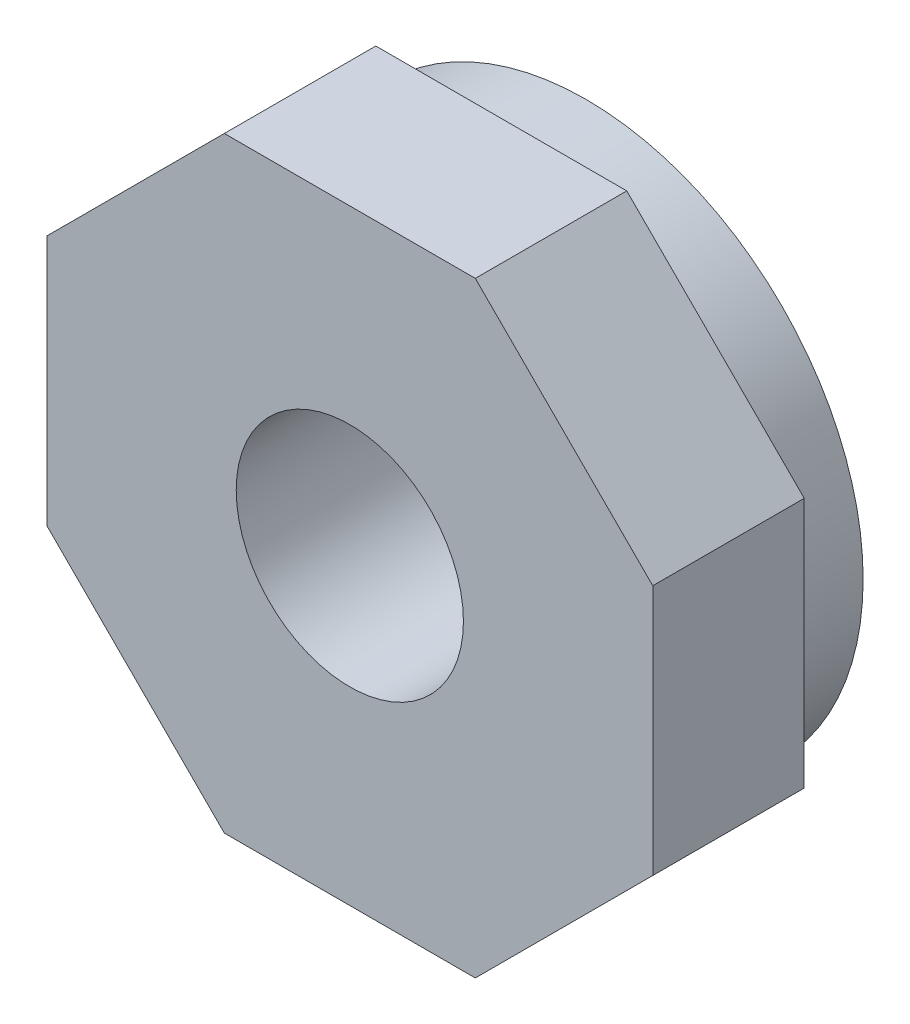
ISO-10303-21;
HEADER;
FILE_DESCRIPTION(('STEP AP214'),'2;1');
FILE_NAME('part.step','',(''),(''),'','','');
FILE_SCHEMA(('AUTOMOTIVE_DESIGN { 1 0 10303 214 1 1 1 1 }'));
ENDSEC;
DATA;
#1=APPLICATION_CONTEXT('core data for automotive mechanical design processes');
#2=APPLICATION_PROTOCOL_DEFINITION('international standard','automotive_design',2000,#1);
#3=PRODUCT_CONTEXT('',#1,'mechanical');
#4=PRODUCT('Part','Part','',(#3));
#5=PRODUCT_RELATED_PRODUCT_CATEGORY('part','',(#4));
#6=PRODUCT_DEFINITION_FORMATION('','',#4);
#7=PRODUCT_DEFINITION_CONTEXT('part definition',#1,'design');
#8=PRODUCT_DEFINITION('design','',#6,#7);
#9=PRODUCT_DEFINITION_SHAPE('','',#8);
#10=(LENGTH_UNIT() NAMED_UNIT(*) SI_UNIT(.MILLI.,.METRE.));
#11=(NAMED_UNIT(*) PLANE_ANGLE_UNIT() SI_UNIT($,.RADIAN.));
#12=(NAMED_UNIT(*) SI_UNIT($,.STERADIAN.) SOLID_ANGLE_UNIT());
#13=UNCERTAINTY_MEASURE_WITH_UNIT(LENGTH_MEASURE(1.E-05),#10,'distance_accuracy_value','');
#14=(GEOMETRIC_REPRESENTATION_CONTEXT(3) GLOBAL_UNCERTAINTY_ASSIGNED_CONTEXT((#13)) GLOBAL_UNIT_ASSIGNED_CONTEXT((#10,
#11,#12)) REPRESENTATION_CONTEXT('',''));
#15=CARTESIAN_POINT('',(0.,0.,0.));
#16=DIRECTION('',(0.,0.,1.));
#17=DIRECTION('',(1.,0.,0.));
#18=AXIS2_PLACEMENT_3D('',#15,#16,#17);
#19=CARTESIAN_POINT('',(0.,-7.12642135623732,0.));
#20=DIRECTION('',(0.,0.,1.));
#21=DIRECTION('',(1.,0.,0.));
#22=AXIS2_PLACEMENT_3D('',#19,#20,#21);
#23=PLANE('',#22);
#24=DIRECTION('',(-0.707106781186547,-0.707106781186548,0.));
#25=VECTOR('',#24,1.);
#26=CARTESIAN_POINT('',(-1.31814664785137,-5.80827470838595,0.));
#27=LINE('',#26,#25);
#28=CARTESIAN_POINT('',(3.175,-1.31512806053456,0.));
#29=VERTEX_POINT('',#28);
#30=CARTESIAN_POINT('',(1.31512806053457,-3.175,0.));
#31=VERTEX_POINT('',#30);
#32=EDGE_CURVE('E129',#29,#31,#27,.T.);
#33=ORIENTED_EDGE('',*,*,#32,.T.);
#34=DIRECTION('',(-1.,0.,0.));
#35=VECTOR('',#34,1.);
#36=CARTESIAN_POINT('',(0.,-3.175,0.));
#37=LINE('',#36,#35);
#38=CARTESIAN_POINT('',(-1.31512806053458,-3.175,0.));
#39=VERTEX_POINT('',#38);
#40=EDGE_CURVE('E147',#31,#39,#37,.T.);
#41=ORIENTED_EDGE('',*,*,#40,.T.);
#42=DIRECTION('',(-0.707106781186547,0.707106781186549,0.));
#43=VECTOR('',#42,1.);
#44=CARTESIAN_POINT('',(1.31814664785137,-5.80827470838596,0.));
#45=LINE('',#44,#43);
#46=CARTESIAN_POINT('',(-3.175,-1.31512806053458,0.));
#47=VERTEX_POINT('',#46);
#48=EDGE_CURVE('E145',#39,#47,#45,.T.);
#49=ORIENTED_EDGE('',*,*,#48,.T.);
#50=DIRECTION('',(0.,1.,0.));
#51=VECTOR('',#50,1.);
#52=CARTESIAN_POINT('',(-3.175,-7.12642135623732,0.));
#53=LINE('',#52,#51);
#54=CARTESIAN_POINT('',(-3.175,1.31512806053457,0.));
#55=VERTEX_POINT('',#54);
#56=EDGE_CURVE('E107',#47,#55,#53,.T.);
#57=ORIENTED_EDGE('',*,*,#56,.T.);
#58=DIRECTION('',(0.707106781186546,0.707106781186549,0.));
#59=VECTOR('',#58,1.);
#60=CARTESIAN_POINT('',(-5.80827470838595,-1.31814664785138,0.));
#61=LINE('',#60,#59);
#62=CARTESIAN_POINT('',(-1.31512806053458,3.175,0.));
#63=VERTEX_POINT('',#62);
#64=EDGE_CURVE('E141',#55,#63,#61,.T.);
#65=ORIENTED_EDGE('',*,*,#64,.T.);
#66=DIRECTION('',(1.,0.,0.));
#67=VECTOR('',#66,1.);
#68=CARTESIAN_POINT('',(0.,3.175,0.));
#69=LINE('',#68,#67);
#70=CARTESIAN_POINT('',(1.31512806053459,3.175,0.));
#71=VERTEX_POINT('',#70);
#72=EDGE_CURVE('E138',#63,#71,#69,.T.);
#73=ORIENTED_EDGE('',*,*,#72,.T.);
#74=DIRECTION('',(0.707106781186546,-0.707106781186549,0.));
#75=VECTOR('',#74,1.);
#76=CARTESIAN_POINT('',(5.80827470838596,-1.31814664785139,0.));
#77=LINE('',#76,#75);
#78=CARTESIAN_POINT('',(3.175,1.31512806053458,0.));
#79=VERTEX_POINT('',#78);
#80=EDGE_CURVE('E135',#71,#79,#77,.T.);
#81=ORIENTED_EDGE('',*,*,#80,.T.);
#82=DIRECTION('',(0.,-1.,0.));
#83=VECTOR('',#82,1.);
#84=CARTESIAN_POINT('',(3.17500000000001,-7.12642135623731,0.));
#85=LINE('',#84,#83);
#86=EDGE_CURVE('E131',#79,#29,#85,.T.);
#87=ORIENTED_EDGE('',*,*,#86,.T.);
#88=EDGE_LOOP('',(#33,#41,#49,#57,#65,#73,#81,#87));
#89=FACE_BOUND('',#88,.T.);
#90=CARTESIAN_POINT('',(0.,0.,0.));
#91=DIRECTION('',(0.,0.,1.));
#92=DIRECTION('',(1.,0.,0.));
#93=AXIS2_PLACEMENT_3D('',#90,#91,#92);
#94=CIRCLE('',#93,2.90316708945455);
#95=CARTESIAN_POINT('',(2.90316708945455,0.,0.));
#96=VERTEX_POINT('',#95);
#97=EDGE_CURVE('E11',#96,#96,#94,.F.);
#98=ORIENTED_EDGE('',*,*,#97,.F.);
#99=EDGE_LOOP('',(#98));
#100=FACE_BOUND('',#99,.T.);
#101=ADVANCED_FACE('F34',(#89,#100),#23,.F.);
#102=CARTESIAN_POINT('',(-1.31814664785137,-5.80827470838595,1.5875));
#103=DIRECTION('',(0.707106781186548,-0.707106781186547,0.));
#104=DIRECTION('',(0.707106781186547,0.707106781186548,0.));
#105=AXIS2_PLACEMENT_3D('',#102,#103,#104);
#106=PLANE('',#105);
#107=ORIENTED_EDGE('',*,*,#32,.F.);
#108=DIRECTION('',(0.,0.,-1.));
#109=VECTOR('',#108,1.);
#110=CARTESIAN_POINT('',(3.175,-1.31512806053456,1.5875));
#111=LINE('',#110,#109);
#112=CARTESIAN_POINT('',(3.175,-1.31512806053456,1.5875));
#113=VERTEX_POINT('',#112);
#114=EDGE_CURVE('E43',#113,#29,#111,.T.);
#115=ORIENTED_EDGE('',*,*,#114,.F.);
#116=DIRECTION('',(-0.707106781186547,-0.707106781186548,0.));
#117=VECTOR('',#116,1.);
#118=CARTESIAN_POINT('',(-1.31814664785137,-5.80827470838595,1.5875));
#119=LINE('',#118,#117);
#120=CARTESIAN_POINT('',(1.31512806053457,-3.175,1.5875));
#121=VERTEX_POINT('',#120);
#122=EDGE_CURVE('E176',#113,#121,#119,.T.);
#123=ORIENTED_EDGE('',*,*,#122,.T.);
#124=DIRECTION('',(0.,0.,-1.));
#125=VECTOR('',#124,1.);
#126=CARTESIAN_POINT('',(1.31512806053457,-3.175,1.5875));
#127=LINE('',#126,#125);
#128=EDGE_CURVE('E51',#121,#31,#127,.T.);
#129=ORIENTED_EDGE('',*,*,#128,.T.);
#130=EDGE_LOOP('',(#107,#115,#123,#129));
#131=FACE_BOUND('',#130,.T.);
#132=ADVANCED_FACE('F165',(#131),#106,.T.);
#133=CARTESIAN_POINT('',(3.17500000000001,-7.12642135623731,1.5875));
#134=DIRECTION('',(1.,0.,0.));
#135=DIRECTION('',(0.,1.,0.));
#136=AXIS2_PLACEMENT_3D('',#133,#134,#135);
#137=PLANE('',#136);
#138=ORIENTED_EDGE('',*,*,#86,.F.);
#139=DIRECTION('',(0.,0.,-1.));
#140=VECTOR('',#139,1.);
#141=CARTESIAN_POINT('',(3.175,1.31512806053458,1.5875));
#142=LINE('',#141,#140);
#143=CARTESIAN_POINT('',(3.175,1.31512806053458,1.5875));
#144=VERTEX_POINT('',#143);
#145=EDGE_CURVE('E158',#144,#79,#142,.T.);
#146=ORIENTED_EDGE('',*,*,#145,.F.);
#147=DIRECTION('',(0.,-1.,0.));
#148=VECTOR('',#147,1.);
#149=CARTESIAN_POINT('',(3.17500000000001,-7.12642135623731,1.5875));
#150=LINE('',#149,#148);
#151=EDGE_CURVE('E164',#144,#113,#150,.T.);
#152=ORIENTED_EDGE('',*,*,#151,.T.);
#153=ORIENTED_EDGE('',*,*,#114,.T.);
#154=EDGE_LOOP('',(#138,#146,#152,#153));
#155=FACE_BOUND('',#154,.T.);
#156=ADVANCED_FACE('F162',(#155),#137,.T.);
#157=CARTESIAN_POINT('',(5.80827470838596,-1.31814664785139,1.5875));
#158=DIRECTION('',(0.707106781186549,0.707106781186546,0.));
#159=DIRECTION('',(-0.707106781186546,0.707106781186549,0.));
#160=AXIS2_PLACEMENT_3D('',#157,#158,#159);
#161=PLANE('',#160);
#162=ORIENTED_EDGE('',*,*,#80,.F.);
#163=DIRECTION('',(0.,0.,-1.));
#164=VECTOR('',#163,1.);
#165=CARTESIAN_POINT('',(1.31512806053459,3.175,1.5875));
#166=LINE('',#165,#164);
#167=CARTESIAN_POINT('',(1.31512806053459,3.175,1.5875));
#168=VERTEX_POINT('',#167);
#169=EDGE_CURVE('E156',#168,#71,#166,.T.);
#170=ORIENTED_EDGE('',*,*,#169,.F.);
#171=DIRECTION('',(0.707106781186546,-0.707106781186549,0.));
#172=VECTOR('',#171,1.);
#173=CARTESIAN_POINT('',(5.80827470838596,-1.31814664785139,1.5875));
#174=LINE('',#173,#172);
#175=EDGE_CURVE('E174',#168,#144,#174,.T.);
#176=ORIENTED_EDGE('',*,*,#175,.T.);
#177=ORIENTED_EDGE('',*,*,#145,.T.);
#178=EDGE_LOOP('',(#162,#170,#176,#177));
#179=FACE_BOUND('',#178,.T.);
#180=ADVANCED_FACE('F171',(#179),#161,.T.);
#181=CARTESIAN_POINT('',(0.,3.175,1.5875));
#182=DIRECTION('',(0.,1.,0.));
#183=DIRECTION('',(0.,0.,1.));
#184=AXIS2_PLACEMENT_3D('',#181,#182,#183);
#185=PLANE('',#184);
#186=ORIENTED_EDGE('',*,*,#72,.F.);
#187=DIRECTION('',(0.,0.,-1.));
#188=VECTOR('',#187,1.);
#189=CARTESIAN_POINT('',(-1.31512806053458,3.175,1.5875));
#190=LINE('',#189,#188);
#191=CARTESIAN_POINT('',(-1.31512806053458,3.175,1.5875));
#192=VERTEX_POINT('',#191);
#193=EDGE_CURVE('E154',#192,#63,#190,.T.);
#194=ORIENTED_EDGE('',*,*,#193,.F.);
#195=DIRECTION('',(1.,0.,0.));
#196=VECTOR('',#195,1.);
#197=CARTESIAN_POINT('',(0.,3.175,1.5875));
#198=LINE('',#197,#196);
#199=EDGE_CURVE('E178',#192,#168,#198,.T.);
#200=ORIENTED_EDGE('',*,*,#199,.T.);
#201=ORIENTED_EDGE('',*,*,#169,.T.);
#202=EDGE_LOOP('',(#186,#194,#200,#201));
#203=FACE_BOUND('',#202,.T.);
#204=ADVANCED_FACE('F284',(#203),#185,.T.);
#205=CARTESIAN_POINT('',(-5.80827470838595,-1.31814664785138,1.5875));
#206=DIRECTION('',(-0.707106781186549,0.707106781186546,0.));
#207=DIRECTION('',(-0.707106781186546,-0.707106781186549,0.));
#208=AXIS2_PLACEMENT_3D('',#205,#206,#207);
#209=PLANE('',#208);
#210=ORIENTED_EDGE('',*,*,#64,.F.);
#211=DIRECTION('',(0.,0.,-1.));
#212=VECTOR('',#211,1.);
#213=CARTESIAN_POINT('',(-3.175,1.31512806053457,1.5875));
#214=LINE('',#213,#212);
#215=CARTESIAN_POINT('',(-3.175,1.31512806053457,1.5875));
#216=VERTEX_POINT('',#215);
#217=EDGE_CURVE('E111',#216,#55,#214,.T.);
#218=ORIENTED_EDGE('',*,*,#217,.F.);
#219=DIRECTION('',(0.707106781186546,0.707106781186549,0.));
#220=VECTOR('',#219,1.);
#221=CARTESIAN_POINT('',(-5.80827470838595,-1.31814664785138,1.5875));
#222=LINE('',#221,#220);
#223=EDGE_CURVE('E121',#216,#192,#222,.T.);
#224=ORIENTED_EDGE('',*,*,#223,.T.);
#225=ORIENTED_EDGE('',*,*,#193,.T.);
#226=EDGE_LOOP('',(#210,#218,#224,#225));
#227=FACE_BOUND('',#226,.T.);
#228=ADVANCED_FACE('F185',(#227),#209,.T.);
#229=CARTESIAN_POINT('',(-3.175,-7.12642135623732,1.5875));
#230=DIRECTION('',(-1.,0.,0.));
#231=DIRECTION('',(0.,0.,1.));
#232=AXIS2_PLACEMENT_3D('',#229,#230,#231);
#233=PLANE('',#232);
#234=ORIENTED_EDGE('',*,*,#56,.F.);
#235=DIRECTION('',(0.,0.,-1.));
#236=VECTOR('',#235,1.);
#237=CARTESIAN_POINT('',(-3.175,-1.31512806053458,1.5875));
#238=LINE('',#237,#236);
#239=CARTESIAN_POINT('',(-3.175,-1.31512806053458,1.5875));
#240=VERTEX_POINT('',#239);
#241=EDGE_CURVE('E102',#240,#47,#238,.T.);
#242=ORIENTED_EDGE('',*,*,#241,.F.);
#243=DIRECTION('',(0.,1.,0.));
#244=VECTOR('',#243,1.);
#245=CARTESIAN_POINT('',(-3.175,-7.12642135623732,1.5875));
#246=LINE('',#245,#244);
#247=EDGE_CURVE('E105',#240,#216,#246,.T.);
#248=ORIENTED_EDGE('',*,*,#247,.T.);
#249=ORIENTED_EDGE('',*,*,#217,.T.);
#250=EDGE_LOOP('',(#234,#242,#248,#249));
#251=FACE_BOUND('',#250,.T.);
#252=ADVANCED_FACE('F104',(#251),#233,.T.);
#253=CARTESIAN_POINT('',(1.31814664785137,-5.80827470838596,1.5875));
#254=DIRECTION('',(-0.707106781186548,-0.707106781186547,0.));
#255=DIRECTION('',(0.707106781186547,-0.707106781186548,0.));
#256=AXIS2_PLACEMENT_3D('',#253,#254,#255);
#257=PLANE('',#256);
#258=ORIENTED_EDGE('',*,*,#48,.F.);
#259=DIRECTION('',(0.,0.,-1.));
#260=VECTOR('',#259,1.);
#261=CARTESIAN_POINT('',(-1.31512806053458,-3.175,1.5875));
#262=LINE('',#261,#260);
#263=CARTESIAN_POINT('',(-1.31512806053458,-3.175,1.5875));
#264=VERTEX_POINT('',#263);
#265=EDGE_CURVE('E77',#264,#39,#262,.T.);
#266=ORIENTED_EDGE('',*,*,#265,.F.);
#267=DIRECTION('',(-0.707106781186547,0.707106781186549,0.));
#268=VECTOR('',#267,1.);
#269=CARTESIAN_POINT('',(1.31814664785137,-5.80827470838596,1.5875));
#270=LINE('',#269,#268);
#271=EDGE_CURVE('E118',#264,#240,#270,.T.);
#272=ORIENTED_EDGE('',*,*,#271,.T.);
#273=ORIENTED_EDGE('',*,*,#241,.T.);
#274=EDGE_LOOP('',(#258,#266,#272,#273));
#275=FACE_BOUND('',#274,.T.);
#276=ADVANCED_FACE('F123',(#275),#257,.T.);
#277=CARTESIAN_POINT('',(0.,0.,1.5875));
#278=DIRECTION('',(0.,0.,-1.));
#279=DIRECTION('',(-1.,0.,0.));
#280=AXIS2_PLACEMENT_3D('',#277,#278,#279);
#281=CYLINDRICAL_SURFACE('',#280,1.190625);
#282=CARTESIAN_POINT('',(0.,0.,1.5875));
#283=DIRECTION('',(0.,0.,1.));
#284=DIRECTION('',(1.,0.,0.));
#285=AXIS2_PLACEMENT_3D('',#282,#283,#284);
#286=CIRCLE('',#285,1.190625);
#287=CARTESIAN_POINT('',(1.190625,0.,1.5875));
#288=VERTEX_POINT('',#287);
#289=EDGE_CURVE('E150',#288,#288,#286,.T.);
#290=ORIENTED_EDGE('',*,*,#289,.T.);
#291=EDGE_LOOP('',(#290));
#292=FACE_BOUND('',#291,.T.);
#293=CARTESIAN_POINT('',(0.,0.,-0.889));
#294=DIRECTION('',(0.,0.,-1.));
#295=DIRECTION('',(-1.,0.,0.));
#296=AXIS2_PLACEMENT_3D('',#293,#294,#295);
#297=CIRCLE('',#296,1.190625);
#298=CARTESIAN_POINT('',(-1.190625,0.,-0.889));
#299=VERTEX_POINT('',#298);
#300=EDGE_CURVE('E217',#299,#299,#297,.T.);
#301=ORIENTED_EDGE('',*,*,#300,.T.);
#302=EDGE_LOOP('',(#301));
#303=FACE_BOUND('',#302,.T.);
#304=ADVANCED_FACE('F36',(#292,#303),#281,.F.);
#305=CARTESIAN_POINT('',(0.,-3.175,1.5875));
#306=DIRECTION('',(0.,-1.,0.));
#307=DIRECTION('',(1.,0.,0.));
#308=AXIS2_PLACEMENT_3D('',#305,#306,#307);
#309=PLANE('',#308);
#310=ORIENTED_EDGE('',*,*,#40,.F.);
#311=ORIENTED_EDGE('',*,*,#128,.F.);
#312=DIRECTION('',(-1.,0.,0.));
#313=VECTOR('',#312,1.);
#314=CARTESIAN_POINT('',(0.,-3.175,1.5875));
#315=LINE('',#314,#313);
#316=EDGE_CURVE('E124',#121,#264,#315,.T.);
#317=ORIENTED_EDGE('',*,*,#316,.T.);
#318=ORIENTED_EDGE('',*,*,#265,.T.);
#319=EDGE_LOOP('',(#310,#311,#317,#318));
#320=FACE_BOUND('',#319,.T.);
#321=ADVANCED_FACE('F186',(#320),#309,.T.);
#322=CARTESIAN_POINT('',(0.,-7.12642135623732,1.5875));
#323=DIRECTION('',(0.,0.,1.));
#324=DIRECTION('',(1.,0.,0.));
#325=AXIS2_PLACEMENT_3D('',#322,#323,#324);
#326=PLANE('',#325);
#327=ORIENTED_EDGE('',*,*,#289,.F.);
#328=EDGE_LOOP('',(#327));
#329=FACE_BOUND('',#328,.T.);
#330=ORIENTED_EDGE('',*,*,#122,.F.);
#331=ORIENTED_EDGE('',*,*,#151,.F.);
#332=ORIENTED_EDGE('',*,*,#175,.F.);
#333=ORIENTED_EDGE('',*,*,#199,.F.);
#334=ORIENTED_EDGE('',*,*,#223,.F.);
#335=ORIENTED_EDGE('',*,*,#247,.F.);
#336=ORIENTED_EDGE('',*,*,#271,.F.);
#337=ORIENTED_EDGE('',*,*,#316,.F.);
#338=EDGE_LOOP('',(#330,#331,#332,#333,#334,#335,#336,#337));
#339=FACE_BOUND('',#338,.T.);
#340=ADVANCED_FACE('F116',(#329,#339),#326,.T.);
#341=CARTESIAN_POINT('',(0.,0.,-0.889));
#342=DIRECTION('',(0.,0.,-1.));
#343=DIRECTION('',(-1.,0.,0.));
#344=AXIS2_PLACEMENT_3D('',#341,#342,#343);
#345=PLANE('',#344);
#346=CARTESIAN_POINT('',(0.,0.,-0.889));
#347=DIRECTION('',(0.,0.,-1.));
#348=DIRECTION('',(-1.,0.,0.));
#349=AXIS2_PLACEMENT_3D('',#346,#347,#348);
#350=CIRCLE('',#349,2.90316708945455);
#351=CARTESIAN_POINT('',(-2.90316708945455,0.,-0.889));
#352=VERTEX_POINT('',#351);
#353=EDGE_CURVE('E132',#352,#352,#350,.T.);
#354=ORIENTED_EDGE('',*,*,#353,.T.);
#355=EDGE_LOOP('',(#354));
#356=FACE_BOUND('',#355,.T.);
#357=ORIENTED_EDGE('',*,*,#300,.F.);
#358=EDGE_LOOP('',(#357));
#359=FACE_BOUND('',#358,.T.);
#360=ADVANCED_FACE('F193',(#356,#359),#345,.T.);
#361=CARTESIAN_POINT('',(0.,0.,-0.889));
#362=DIRECTION('',(0.,0.,1.));
#363=DIRECTION('',(1.,0.,0.));
#364=AXIS2_PLACEMENT_3D('',#361,#362,#363);
#365=CYLINDRICAL_SURFACE('',#364,2.90316708945455);
#366=ORIENTED_EDGE('',*,*,#353,.F.);
#367=EDGE_LOOP('',(#366));
#368=FACE_BOUND('',#367,.T.);
#369=ORIENTED_EDGE('',*,*,#97,.T.);
#370=EDGE_LOOP('',(#369));
#371=FACE_BOUND('',#370,.T.);
#372=ADVANCED_FACE('F204',(#368,#371),#365,.T.);
#373=CLOSED_SHELL('',(#101,#132,#156,#180,#204,#228,#252,#276,#304,#321,#340,#360,#372));
#374=MANIFOLD_SOLID_BREP('B2',#373);
#375=ADVANCED_BREP_SHAPE_REPRESENTATION('',(#18,#374),#14);
#376=SHAPE_DEFINITION_REPRESENTATION(#9,#375);
ENDSEC;
END-ISO-10303-21;
